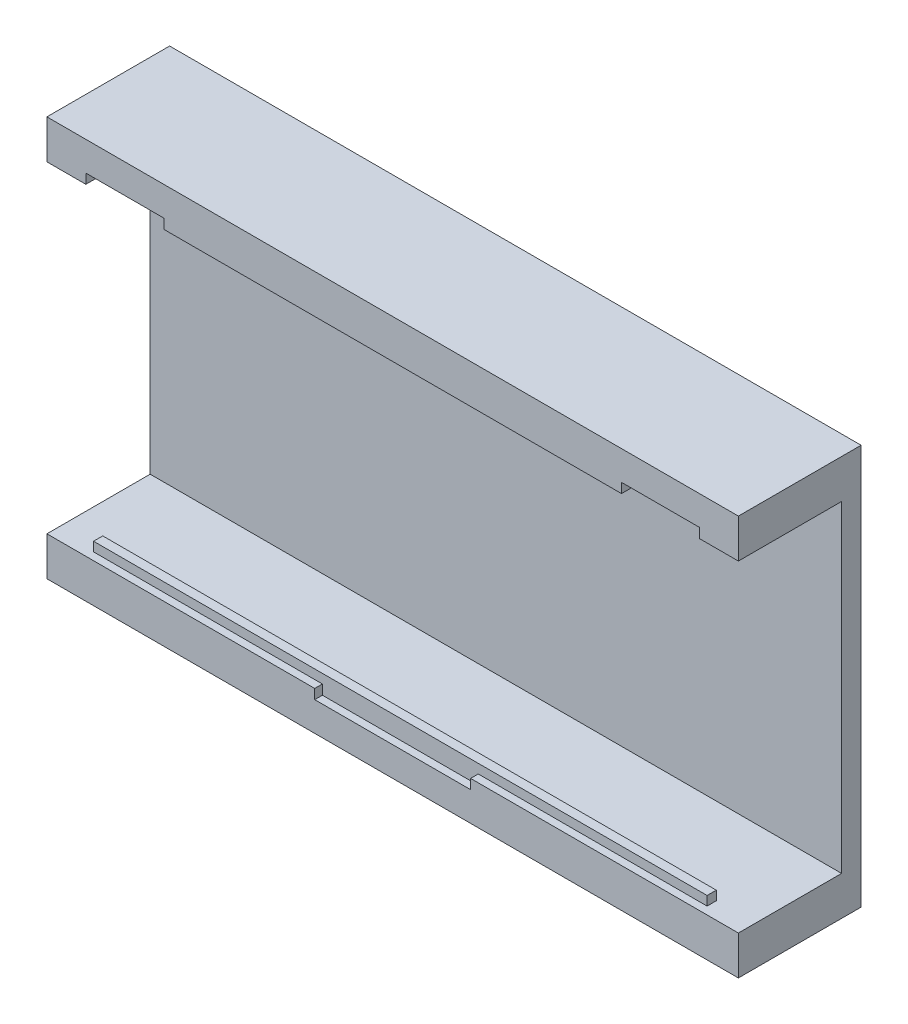
ISO-10303-21;
HEADER;
FILE_DESCRIPTION(('STEP AP214'),'2;1');
FILE_NAME('part.step','',(''),(''),'','','');
FILE_SCHEMA(('AUTOMOTIVE_DESIGN { 1 0 10303 214 1 1 1 1 }'));
ENDSEC;
DATA;
#1=APPLICATION_CONTEXT('core data for automotive mechanical design processes');
#2=APPLICATION_PROTOCOL_DEFINITION('international standard','automotive_design',2000,#1);
#3=PRODUCT_CONTEXT('',#1,'mechanical');
#4=PRODUCT('Part','Part','',(#3));
#5=PRODUCT_RELATED_PRODUCT_CATEGORY('part','',(#4));
#6=PRODUCT_DEFINITION_FORMATION('','',#4);
#7=PRODUCT_DEFINITION_CONTEXT('part definition',#1,'design');
#8=PRODUCT_DEFINITION('design','',#6,#7);
#9=PRODUCT_DEFINITION_SHAPE('','',#8);
#10=(LENGTH_UNIT() NAMED_UNIT(*) SI_UNIT(.MILLI.,.METRE.));
#11=(NAMED_UNIT(*) PLANE_ANGLE_UNIT() SI_UNIT($,.RADIAN.));
#12=(NAMED_UNIT(*) SI_UNIT($,.STERADIAN.) SOLID_ANGLE_UNIT());
#13=UNCERTAINTY_MEASURE_WITH_UNIT(LENGTH_MEASURE(1.E-05),#10,'distance_accuracy_value','');
#14=(GEOMETRIC_REPRESENTATION_CONTEXT(3) GLOBAL_UNCERTAINTY_ASSIGNED_CONTEXT((#13)) GLOBAL_UNIT_ASSIGNED_CONTEXT((#10,
#11,#12)) REPRESENTATION_CONTEXT('',''));
#15=CARTESIAN_POINT('',(0.,0.,0.));
#16=DIRECTION('',(0.,0.,1.));
#17=DIRECTION('',(1.,0.,0.));
#18=AXIS2_PLACEMENT_3D('',#15,#16,#17);
#19=CARTESIAN_POINT('',(100.000000000052,-500000.,-33.65));
#20=DIRECTION('',(0.,0.,-1.));
#21=DIRECTION('',(-1.,0.,0.));
#22=AXIS2_PLACEMENT_3D('',#19,#20,#21);
#23=PLANE('',#22);
#24=DIRECTION('',(0.,1.,0.));
#25=VECTOR('',#24,1.);
#26=CARTESIAN_POINT('',(-2.49999999999995,-500000.,-33.65));
#27=LINE('',#26,#25);
#28=CARTESIAN_POINT('',(-2.49999999999995,39.5301270189222,-33.65));
#29=VERTEX_POINT('',#28);
#30=CARTESIAN_POINT('',(-2.49999999999995,43.2,-33.65));
#31=VERTEX_POINT('',#30);
#32=EDGE_CURVE('E52',#29,#31,#27,.T.);
#33=ORIENTED_EDGE('',*,*,#32,.T.);
#34=CARTESIAN_POINT('',(0.,43.2,-33.65));
#35=DIRECTION('',(0.,0.,-1.));
#36=DIRECTION('',(-1.,0.,0.));
#37=AXIS2_PLACEMENT_3D('',#34,#35,#36);
#38=CIRCLE('',#37,2.5);
#39=CARTESIAN_POINT('',(2.50000000000005,43.2,-33.65));
#40=VERTEX_POINT('',#39);
#41=EDGE_CURVE('E12',#31,#40,#38,.T.);
#42=ORIENTED_EDGE('',*,*,#41,.T.);
#43=DIRECTION('',(0.,-1.,0.));
#44=VECTOR('',#43,1.);
#45=CARTESIAN_POINT('',(2.50000000000006,-500000.,-33.65));
#46=LINE('',#45,#44);
#47=CARTESIAN_POINT('',(2.50000000000006,39.5301270189066,-33.65));
#48=VERTEX_POINT('',#47);
#49=EDGE_CURVE('E273',#40,#48,#46,.T.);
#50=ORIENTED_EDGE('',*,*,#49,.T.);
#51=CARTESIAN_POINT('',(0.,35.2,-33.65));
#52=DIRECTION('',(0.,0.,-1.));
#53=DIRECTION('',(-1.,0.,0.));
#54=AXIS2_PLACEMENT_3D('',#51,#52,#53);
#55=CIRCLE('',#54,5.);
#56=EDGE_CURVE('E287',#48,#29,#55,.T.);
#57=ORIENTED_EDGE('',*,*,#56,.T.);
#58=EDGE_LOOP('',(#33,#42,#50,#57));
#59=FACE_BOUND('',#58,.T.);
#60=DIRECTION('',(0.,-1.,0.));
#61=VECTOR('',#60,1.);
#62=CARTESIAN_POINT('',(-112.7,52.5,-33.65));
#63=LINE('',#62,#61);
#64=CARTESIAN_POINT('',(-112.7,52.5,-33.65));
#65=VERTEX_POINT('',#64);
#66=CARTESIAN_POINT('',(-112.7,-52.5,-33.65));
#67=VERTEX_POINT('',#66);
#68=EDGE_CURVE('E297',#65,#67,#63,.T.);
#69=ORIENTED_EDGE('',*,*,#68,.T.);
#70=DIRECTION('',(-1.,0.,0.));
#71=VECTOR('',#70,1.);
#72=CARTESIAN_POINT('',(100.000000000052,-52.5000000000091,-33.65));
#73=LINE('',#72,#71);
#74=CARTESIAN_POINT('',(112.7,-52.5,-33.65));
#75=VERTEX_POINT('',#74);
#76=EDGE_CURVE('E439',#75,#67,#73,.T.);
#77=ORIENTED_EDGE('',*,*,#76,.F.);
#78=DIRECTION('',(0.,-1.,0.));
#79=VECTOR('',#78,1.);
#80=CARTESIAN_POINT('',(112.7,-47.5,-33.65));
#81=LINE('',#80,#79);
#82=CARTESIAN_POINT('',(112.7,52.5,-33.65));
#83=VERTEX_POINT('',#82);
#84=EDGE_CURVE('E253',#83,#75,#81,.T.);
#85=ORIENTED_EDGE('',*,*,#84,.F.);
#86=DIRECTION('',(-1.,0.,0.));
#87=VECTOR('',#86,1.);
#88=CARTESIAN_POINT('',(100.,52.5,-33.65));
#89=LINE('',#88,#87);
#90=EDGE_CURVE('E431',#83,#65,#89,.T.);
#91=ORIENTED_EDGE('',*,*,#90,.T.);
#92=EDGE_LOOP('',(#69,#77,#85,#91));
#93=FACE_BOUND('',#92,.T.);
#94=ADVANCED_FACE('F42',(#59,#93),#23,.F.);
#95=CARTESIAN_POINT('',(0.,0.,0.));
#96=DIRECTION('',(0.,0.,1.));
#97=DIRECTION('',(1.,0.,0.));
#98=AXIS2_PLACEMENT_3D('',#95,#96,#97);
#99=PLANE('',#98);
#100=DIRECTION('',(-1.,0.,0.));
#101=VECTOR('',#100,1.);
#102=CARTESIAN_POINT('',(100.,52.5,0.));
#103=LINE('',#102,#101);
#104=CARTESIAN_POINT('',(112.7,52.5,0.));
#105=VERTEX_POINT('',#104);
#106=CARTESIAN_POINT('',(100.,52.5,0.));
#107=VERTEX_POINT('',#106);
#108=EDGE_CURVE('E315',#105,#107,#103,.T.);
#109=ORIENTED_EDGE('',*,*,#108,.F.);
#110=DIRECTION('',(0.,-1.,0.));
#111=VECTOR('',#110,1.);
#112=CARTESIAN_POINT('',(112.7,0.,0.));
#113=LINE('',#112,#111);
#114=CARTESIAN_POINT('',(112.7,65.2,0.));
#115=VERTEX_POINT('',#114);
#116=EDGE_CURVE('E260',#115,#105,#113,.T.);
#117=ORIENTED_EDGE('',*,*,#116,.F.);
#118=DIRECTION('',(1.,0.,0.));
#119=VECTOR('',#118,1.);
#120=CARTESIAN_POINT('',(0.,65.2,0.));
#121=LINE('',#120,#119);
#122=CARTESIAN_POINT('',(-112.7,65.2,0.));
#123=VERTEX_POINT('',#122);
#124=EDGE_CURVE('E263',#123,#115,#121,.T.);
#125=ORIENTED_EDGE('',*,*,#124,.F.);
#126=DIRECTION('',(0.,1.,0.));
#127=VECTOR('',#126,1.);
#128=CARTESIAN_POINT('',(-112.7,0.,0.));
#129=LINE('',#128,#127);
#130=CARTESIAN_POINT('',(-112.7,52.5,0.));
#131=VERTEX_POINT('',#130);
#132=EDGE_CURVE('E455',#131,#123,#129,.T.);
#133=ORIENTED_EDGE('',*,*,#132,.F.);
#134=DIRECTION('',(-1.,0.,0.));
#135=VECTOR('',#134,1.);
#136=CARTESIAN_POINT('',(-100.,52.5,0.));
#137=LINE('',#136,#135);
#138=CARTESIAN_POINT('',(-100.,52.5,0.));
#139=VERTEX_POINT('',#138);
#140=EDGE_CURVE('E305',#139,#131,#137,.T.);
#141=ORIENTED_EDGE('',*,*,#140,.F.);
#142=DIRECTION('',(0.,-1.,0.));
#143=VECTOR('',#142,1.);
#144=CARTESIAN_POINT('',(-100.,0.,0.));
#145=LINE('',#144,#143);
#146=CARTESIAN_POINT('',(-100.,55.675,0.));
#147=VERTEX_POINT('',#146);
#148=EDGE_CURVE('E443',#147,#139,#145,.T.);
#149=ORIENTED_EDGE('',*,*,#148,.F.);
#150=DIRECTION('',(-1.,0.,0.));
#151=VECTOR('',#150,1.);
#152=CARTESIAN_POINT('',(-74.6,55.675,0.));
#153=LINE('',#152,#151);
#154=CARTESIAN_POINT('',(-74.6,55.675,0.));
#155=VERTEX_POINT('',#154);
#156=EDGE_CURVE('E344',#155,#147,#153,.T.);
#157=ORIENTED_EDGE('',*,*,#156,.F.);
#158=DIRECTION('',(0.,1.,0.));
#159=VECTOR('',#158,1.);
#160=CARTESIAN_POINT('',(-74.6,52.5,0.));
#161=LINE('',#160,#159);
#162=CARTESIAN_POINT('',(-74.6,52.5,0.));
#163=VERTEX_POINT('',#162);
#164=EDGE_CURVE('E336',#163,#155,#161,.T.);
#165=ORIENTED_EDGE('',*,*,#164,.F.);
#166=DIRECTION('',(-1.,0.,0.));
#167=VECTOR('',#166,1.);
#168=CARTESIAN_POINT('',(0.,52.5,0.));
#169=LINE('',#168,#167);
#170=CARTESIAN_POINT('',(74.6,52.5,0.));
#171=VERTEX_POINT('',#170);
#172=EDGE_CURVE('E67',#171,#163,#169,.T.);
#173=ORIENTED_EDGE('',*,*,#172,.F.);
#174=DIRECTION('',(0.,1.,0.));
#175=VECTOR('',#174,1.);
#176=CARTESIAN_POINT('',(74.6,52.5,0.));
#177=LINE('',#176,#175);
#178=CARTESIAN_POINT('',(74.6,55.675,0.));
#179=VERTEX_POINT('',#178);
#180=EDGE_CURVE('E320',#171,#179,#177,.T.);
#181=ORIENTED_EDGE('',*,*,#180,.T.);
#182=DIRECTION('',(1.,0.,0.));
#183=VECTOR('',#182,1.);
#184=CARTESIAN_POINT('',(74.6,55.675,0.));
#185=LINE('',#184,#183);
#186=CARTESIAN_POINT('',(100.,55.675,0.));
#187=VERTEX_POINT('',#186);
#188=EDGE_CURVE('E328',#179,#187,#185,.T.);
#189=ORIENTED_EDGE('',*,*,#188,.T.);
#190=DIRECTION('',(0.,1.,0.));
#191=VECTOR('',#190,1.);
#192=CARTESIAN_POINT('',(100.,0.,0.));
#193=LINE('',#192,#191);
#194=EDGE_CURVE('E59',#107,#187,#193,.T.);
#195=ORIENTED_EDGE('',*,*,#194,.F.);
#196=EDGE_LOOP('',(#109,#117,#125,#133,#141,#149,#157,#165,#173,#181,#189,#195));
#197=FACE_BOUND('',#196,.T.);
#198=ADVANCED_FACE('F470',(#197),#99,.T.);
#199=CARTESIAN_POINT('',(0.,52.5,-40.));
#200=DIRECTION('',(0.,1.,0.));
#201=DIRECTION('',(-1.,0.,0.));
#202=AXIS2_PLACEMENT_3D('',#199,#200,#201);
#203=PLANE('',#202);
#204=DIRECTION('',(0.,0.,1.));
#205=VECTOR('',#204,1.);
#206=CARTESIAN_POINT('',(74.6,52.5,-22.86));
#207=LINE('',#206,#205);
#208=CARTESIAN_POINT('',(74.6,52.5,-22.86));
#209=VERTEX_POINT('',#208);
#210=EDGE_CURVE('E334',#209,#171,#207,.T.);
#211=ORIENTED_EDGE('',*,*,#210,.T.);
#212=ORIENTED_EDGE('',*,*,#172,.T.);
#213=DIRECTION('',(0.,0.,1.));
#214=VECTOR('',#213,1.);
#215=CARTESIAN_POINT('',(-74.6,52.5,-22.86));
#216=LINE('',#215,#214);
#217=CARTESIAN_POINT('',(-74.6,52.5,-22.86));
#218=VERTEX_POINT('',#217);
#219=EDGE_CURVE('E353',#218,#163,#216,.T.);
#220=ORIENTED_EDGE('',*,*,#219,.F.);
#221=DIRECTION('',(1.,0.,0.));
#222=VECTOR('',#221,1.);
#223=CARTESIAN_POINT('',(-100.,52.5,-22.86));
#224=LINE('',#223,#222);
#225=CARTESIAN_POINT('',(-100.,52.5,-22.86));
#226=VERTEX_POINT('',#225);
#227=EDGE_CURVE('E343',#226,#218,#224,.T.);
#228=ORIENTED_EDGE('',*,*,#227,.F.);
#229=DIRECTION('',(0.,0.,1.));
#230=VECTOR('',#229,1.);
#231=CARTESIAN_POINT('',(-100.,52.5,-139.415258946405));
#232=LINE('',#231,#230);
#233=EDGE_CURVE('E309',#226,#139,#232,.T.);
#234=ORIENTED_EDGE('',*,*,#233,.T.);
#235=ORIENTED_EDGE('',*,*,#140,.T.);
#236=DIRECTION('',(0.,0.,1.));
#237=VECTOR('',#236,1.);
#238=CARTESIAN_POINT('',(-112.7,52.5,-139.415258946405));
#239=LINE('',#238,#237);
#240=EDGE_CURVE('E304',#65,#131,#239,.T.);
#241=ORIENTED_EDGE('',*,*,#240,.F.);
#242=ORIENTED_EDGE('',*,*,#90,.F.);
#243=DIRECTION('',(0.,0.,1.));
#244=VECTOR('',#243,1.);
#245=CARTESIAN_POINT('',(112.7,52.5,-139.415258946405));
#246=LINE('',#245,#244);
#247=EDGE_CURVE('E331',#83,#105,#246,.T.);
#248=ORIENTED_EDGE('',*,*,#247,.T.);
#249=ORIENTED_EDGE('',*,*,#108,.T.);
#250=DIRECTION('',(0.,0.,1.));
#251=VECTOR('',#250,1.);
#252=CARTESIAN_POINT('',(100.,52.5,-139.415258946405));
#253=LINE('',#252,#251);
#254=CARTESIAN_POINT('',(100.,52.5,-22.86));
#255=VERTEX_POINT('',#254);
#256=EDGE_CURVE('E828',#255,#107,#253,.T.);
#257=ORIENTED_EDGE('',*,*,#256,.F.);
#258=DIRECTION('',(-1.,0.,0.));
#259=VECTOR('',#258,1.);
#260=CARTESIAN_POINT('',(100.,52.5,-22.86));
#261=LINE('',#260,#259);
#262=EDGE_CURVE('E324',#255,#209,#261,.T.);
#263=ORIENTED_EDGE('',*,*,#262,.T.);
#264=EDGE_LOOP('',(#211,#212,#220,#228,#234,#235,#241,#242,#248,#249,#257,#263));
#265=FACE_BOUND('',#264,.T.);
#266=ADVANCED_FACE('F484',(#265),#203,.F.);
#267=CARTESIAN_POINT('',(112.7,-52.5,0.));
#268=VERTEX_POINT('',#267);
#269=CARTESIAN_POINT('',(112.7,-65.2,0.));
#270=VERTEX_POINT('',#269);
#271=EDGE_CURVE('E250',#268,#270,#113,.T.);
#272=ORIENTED_EDGE('',*,*,#271,.F.);
#273=DIRECTION('',(1.,0.,0.));
#274=VECTOR('',#273,1.);
#275=CARTESIAN_POINT('',(0.,-52.5,0.));
#276=LINE('',#275,#274);
#277=CARTESIAN_POINT('',(25.4,-52.5,0.));
#278=VERTEX_POINT('',#277);
#279=EDGE_CURVE('E234',#278,#268,#276,.T.);
#280=ORIENTED_EDGE('',*,*,#279,.F.);
#281=DIRECTION('',(0.,1.,0.));
#282=VECTOR('',#281,1.);
#283=CARTESIAN_POINT('',(25.3999999999999,-55.675,0.));
#284=LINE('',#283,#282);
#285=CARTESIAN_POINT('',(25.3999999999999,-55.675,0.));
#286=VERTEX_POINT('',#285);
#287=EDGE_CURVE('E361',#286,#278,#284,.T.);
#288=ORIENTED_EDGE('',*,*,#287,.F.);
#289=DIRECTION('',(1.,0.,0.));
#290=VECTOR('',#289,1.);
#291=CARTESIAN_POINT('',(-25.4000000000001,-55.675,0.));
#292=LINE('',#291,#290);
#293=CARTESIAN_POINT('',(-25.4000000000001,-55.675,0.));
#294=VERTEX_POINT('',#293);
#295=EDGE_CURVE('E365',#294,#286,#292,.T.);
#296=ORIENTED_EDGE('',*,*,#295,.F.);
#297=DIRECTION('',(0.,-1.,0.));
#298=VECTOR('',#297,1.);
#299=CARTESIAN_POINT('',(-25.4,-52.5,0.));
#300=LINE('',#299,#298);
#301=CARTESIAN_POINT('',(-25.4,-52.5,0.));
#302=VERTEX_POINT('',#301);
#303=EDGE_CURVE('E369',#302,#294,#300,.T.);
#304=ORIENTED_EDGE('',*,*,#303,.F.);
#305=CARTESIAN_POINT('',(-112.7,-52.5,0.));
#306=VERTEX_POINT('',#305);
#307=EDGE_CURVE('E244',#306,#302,#276,.T.);
#308=ORIENTED_EDGE('',*,*,#307,.F.);
#309=CARTESIAN_POINT('',(-112.7,-65.2,0.));
#310=VERTEX_POINT('',#309);
#311=EDGE_CURVE('E264',#310,#306,#129,.T.);
#312=ORIENTED_EDGE('',*,*,#311,.F.);
#313=DIRECTION('',(-1.,0.,0.));
#314=VECTOR('',#313,1.);
#315=CARTESIAN_POINT('',(0.,-65.2,0.));
#316=LINE('',#315,#314);
#317=EDGE_CURVE('E259',#270,#310,#316,.T.);
#318=ORIENTED_EDGE('',*,*,#317,.F.);
#319=EDGE_LOOP('',(#272,#280,#288,#296,#304,#308,#312,#318));
#320=FACE_BOUND('',#319,.T.);
#321=ADVANCED_FACE('F257',(#320),#99,.T.);
#322=CARTESIAN_POINT('',(-100.,0.,-40.));
#323=DIRECTION('',(-1.,0.,0.));
#324=DIRECTION('',(0.,-1.,0.));
#325=AXIS2_PLACEMENT_3D('',#322,#323,#324);
#326=PLANE('',#325);
#327=ORIENTED_EDGE('',*,*,#148,.T.);
#328=ORIENTED_EDGE('',*,*,#233,.F.);
#329=DIRECTION('',(0.,-1.,0.));
#330=VECTOR('',#329,1.);
#331=CARTESIAN_POINT('',(-100.,55.675,-22.86));
#332=LINE('',#331,#330);
#333=CARTESIAN_POINT('',(-100.,55.675,-22.86));
#334=VERTEX_POINT('',#333);
#335=EDGE_CURVE('E340',#334,#226,#332,.T.);
#336=ORIENTED_EDGE('',*,*,#335,.F.);
#337=DIRECTION('',(0.,0.,1.));
#338=VECTOR('',#337,1.);
#339=CARTESIAN_POINT('',(-100.,55.675,-22.86));
#340=LINE('',#339,#338);
#341=EDGE_CURVE('E358',#334,#147,#340,.T.);
#342=ORIENTED_EDGE('',*,*,#341,.T.);
#343=EDGE_LOOP('',(#327,#328,#336,#342));
#344=FACE_BOUND('',#343,.T.);
#345=ADVANCED_FACE('F44',(#344),#326,.F.);
#346=CARTESIAN_POINT('',(0.,-52.5,-40.));
#347=DIRECTION('',(0.,-1.,0.));
#348=DIRECTION('',(0.,0.,-1.));
#349=AXIS2_PLACEMENT_3D('',#346,#347,#348);
#350=PLANE('',#349);
#351=ORIENTED_EDGE('',*,*,#76,.T.);
#352=DIRECTION('',(0.,0.,1.));
#353=VECTOR('',#352,1.);
#354=CARTESIAN_POINT('',(-112.7,-52.5,-139.415258946405));
#355=LINE('',#354,#353);
#356=EDGE_CURVE('E303',#67,#306,#355,.T.);
#357=ORIENTED_EDGE('',*,*,#356,.T.);
#358=ORIENTED_EDGE('',*,*,#307,.T.);
#359=DIRECTION('',(0.,0.,1.));
#360=VECTOR('',#359,1.);
#361=CARTESIAN_POINT('',(-25.4,-52.5,-53.3991220454735));
#362=LINE('',#361,#360);
#363=CARTESIAN_POINT('',(-25.4,-52.5,-2.5));
#364=VERTEX_POINT('',#363);
#365=EDGE_CURVE('E368',#364,#302,#362,.T.);
#366=ORIENTED_EDGE('',*,*,#365,.F.);
#367=DIRECTION('',(-1.,0.,0.));
#368=VECTOR('',#367,1.);
#369=CARTESIAN_POINT('',(500000.,-52.4999999998678,-2.5));
#370=LINE('',#369,#368);
#371=CARTESIAN_POINT('',(-100.,-52.5,-2.5));
#372=VERTEX_POINT('',#371);
#373=EDGE_CURVE('E406',#364,#372,#370,.T.);
#374=ORIENTED_EDGE('',*,*,#373,.T.);
#375=DIRECTION('',(0.,0.,1.));
#376=VECTOR('',#375,1.);
#377=CARTESIAN_POINT('',(-100.,-52.5,-139.415258946405));
#378=LINE('',#377,#376);
#379=CARTESIAN_POINT('',(-100.,-52.5,-5.50000000000001));
#380=VERTEX_POINT('',#379);
#381=EDGE_CURVE('E311',#380,#372,#378,.T.);
#382=ORIENTED_EDGE('',*,*,#381,.F.);
#383=DIRECTION('',(-1.,0.,0.));
#384=VECTOR('',#383,1.);
#385=CARTESIAN_POINT('',(500000.,-52.4999999998678,-5.5));
#386=LINE('',#385,#384);
#387=CARTESIAN_POINT('',(100.000000000136,-52.5,-5.5));
#388=VERTEX_POINT('',#387);
#389=EDGE_CURVE('E403',#388,#380,#386,.T.);
#390=ORIENTED_EDGE('',*,*,#389,.F.);
#391=DIRECTION('',(0.,0.,1.));
#392=VECTOR('',#391,1.);
#393=CARTESIAN_POINT('',(100.,-52.5,-139.415258946405));
#394=LINE('',#393,#392);
#395=CARTESIAN_POINT('',(100.,-52.5,-2.5));
#396=VERTEX_POINT('',#395);
#397=EDGE_CURVE('E831',#388,#396,#394,.T.);
#398=ORIENTED_EDGE('',*,*,#397,.T.);
#399=CARTESIAN_POINT('',(25.4000000001042,-52.5,-2.5));
#400=VERTEX_POINT('',#399);
#401=EDGE_CURVE('E407',#396,#400,#370,.T.);
#402=ORIENTED_EDGE('',*,*,#401,.T.);
#403=DIRECTION('',(0.,0.,1.));
#404=VECTOR('',#403,1.);
#405=CARTESIAN_POINT('',(25.4,-52.5,-53.3991220454735));
#406=LINE('',#405,#404);
#407=EDGE_CURVE('E240',#400,#278,#406,.T.);
#408=ORIENTED_EDGE('',*,*,#407,.T.);
#409=ORIENTED_EDGE('',*,*,#279,.T.);
#410=DIRECTION('',(0.,0.,1.));
#411=VECTOR('',#410,1.);
#412=CARTESIAN_POINT('',(112.7,-52.5,-33.65));
#413=LINE('',#412,#411);
#414=EDGE_CURVE('E237',#75,#268,#413,.T.);
#415=ORIENTED_EDGE('',*,*,#414,.F.);
#416=EDGE_LOOP('',(#351,#357,#358,#366,#374,#382,#390,#398,#402,#408,#409,#415));
#417=FACE_BOUND('',#416,.T.);
#418=ADVANCED_FACE('F236',(#417),#350,.F.);
#419=CARTESIAN_POINT('',(100.,0.,-40.));
#420=DIRECTION('',(1.,0.,0.));
#421=DIRECTION('',(0.,1.,0.));
#422=AXIS2_PLACEMENT_3D('',#419,#420,#421);
#423=PLANE('',#422);
#424=DIRECTION('',(0.,-1.,0.));
#425=VECTOR('',#424,1.);
#426=CARTESIAN_POINT('',(100.,55.675,-22.86));
#427=LINE('',#426,#425);
#428=CARTESIAN_POINT('',(100.,55.675,-22.86));
#429=VERTEX_POINT('',#428);
#430=EDGE_CURVE('E316',#429,#255,#427,.T.);
#431=ORIENTED_EDGE('',*,*,#430,.T.);
#432=ORIENTED_EDGE('',*,*,#256,.T.);
#433=ORIENTED_EDGE('',*,*,#194,.T.);
#434=DIRECTION('',(0.,0.,1.));
#435=VECTOR('',#434,1.);
#436=CARTESIAN_POINT('',(100.,55.675,-22.86));
#437=LINE('',#436,#435);
#438=EDGE_CURVE('E327',#429,#187,#437,.T.);
#439=ORIENTED_EDGE('',*,*,#438,.F.);
#440=EDGE_LOOP('',(#431,#432,#433,#439));
#441=FACE_BOUND('',#440,.T.);
#442=ADVANCED_FACE('F535',(#441),#423,.F.);
#443=CARTESIAN_POINT('',(-112.7,0.,-40.));
#444=DIRECTION('',(1.,0.,0.));
#445=DIRECTION('',(0.,1.,0.));
#446=AXIS2_PLACEMENT_3D('',#443,#444,#445);
#447=PLANE('',#446);
#448=ORIENTED_EDGE('',*,*,#311,.T.);
#449=ORIENTED_EDGE('',*,*,#356,.F.);
#450=ORIENTED_EDGE('',*,*,#68,.F.);
#451=ORIENTED_EDGE('',*,*,#240,.T.);
#452=ORIENTED_EDGE('',*,*,#132,.T.);
#453=DIRECTION('',(0.,0.,1.));
#454=VECTOR('',#453,1.);
#455=CARTESIAN_POINT('',(-112.7,65.2,-40.));
#456=LINE('',#455,#454);
#457=CARTESIAN_POINT('',(-112.7,65.2,-40.));
#458=VERTEX_POINT('',#457);
#459=EDGE_CURVE('E270',#458,#123,#456,.T.);
#460=ORIENTED_EDGE('',*,*,#459,.F.);
#461=DIRECTION('',(0.,1.,0.));
#462=VECTOR('',#461,1.);
#463=CARTESIAN_POINT('',(-112.7,0.,-40.));
#464=LINE('',#463,#462);
#465=CARTESIAN_POINT('',(-112.7,-65.2,-40.));
#466=VERTEX_POINT('',#465);
#467=EDGE_CURVE('E269',#466,#458,#464,.T.);
#468=ORIENTED_EDGE('',*,*,#467,.F.);
#469=DIRECTION('',(0.,0.,1.));
#470=VECTOR('',#469,1.);
#471=CARTESIAN_POINT('',(-112.7,-65.2,-40.));
#472=LINE('',#471,#470);
#473=EDGE_CURVE('E279',#466,#310,#472,.T.);
#474=ORIENTED_EDGE('',*,*,#473,.T.);
#475=EDGE_LOOP('',(#448,#449,#450,#451,#452,#460,#468,#474));
#476=FACE_BOUND('',#475,.T.);
#477=ADVANCED_FACE('F462',(#476),#447,.F.);
#478=CARTESIAN_POINT('',(0.,65.2,-40.));
#479=DIRECTION('',(0.,-1.,0.));
#480=DIRECTION('',(1.,0.,0.));
#481=AXIS2_PLACEMENT_3D('',#478,#479,#480);
#482=PLANE('',#481);
#483=ORIENTED_EDGE('',*,*,#124,.T.);
#484=DIRECTION('',(0.,0.,1.));
#485=VECTOR('',#484,1.);
#486=CARTESIAN_POINT('',(112.7,65.2,-40.));
#487=LINE('',#486,#485);
#488=CARTESIAN_POINT('',(112.7,65.2,-40.));
#489=VERTEX_POINT('',#488);
#490=EDGE_CURVE('E274',#489,#115,#487,.T.);
#491=ORIENTED_EDGE('',*,*,#490,.F.);
#492=DIRECTION('',(1.,0.,0.));
#493=VECTOR('',#492,1.);
#494=CARTESIAN_POINT('',(0.,65.2,-40.));
#495=LINE('',#494,#493);
#496=EDGE_CURVE('E282',#458,#489,#495,.T.);
#497=ORIENTED_EDGE('',*,*,#496,.F.);
#498=ORIENTED_EDGE('',*,*,#459,.T.);
#499=EDGE_LOOP('',(#483,#491,#497,#498));
#500=FACE_BOUND('',#499,.T.);
#501=ADVANCED_FACE('F473',(#500),#482,.F.);
#502=CARTESIAN_POINT('',(112.7,0.,-40.));
#503=DIRECTION('',(-1.,0.,0.));
#504=DIRECTION('',(0.,-1.,0.));
#505=AXIS2_PLACEMENT_3D('',#502,#503,#504);
#506=PLANE('',#505);
#507=ORIENTED_EDGE('',*,*,#247,.F.);
#508=ORIENTED_EDGE('',*,*,#84,.T.);
#509=ORIENTED_EDGE('',*,*,#414,.T.);
#510=ORIENTED_EDGE('',*,*,#271,.T.);
#511=DIRECTION('',(0.,0.,1.));
#512=VECTOR('',#511,1.);
#513=CARTESIAN_POINT('',(112.7,-65.2,-40.));
#514=LINE('',#513,#512);
#515=CARTESIAN_POINT('',(112.7,-65.2,-40.));
#516=VERTEX_POINT('',#515);
#517=EDGE_CURVE('E277',#516,#270,#514,.T.);
#518=ORIENTED_EDGE('',*,*,#517,.F.);
#519=DIRECTION('',(0.,-1.,0.));
#520=VECTOR('',#519,1.);
#521=CARTESIAN_POINT('',(112.7,0.,-40.));
#522=LINE('',#521,#520);
#523=EDGE_CURVE('E448',#489,#516,#522,.T.);
#524=ORIENTED_EDGE('',*,*,#523,.F.);
#525=ORIENTED_EDGE('',*,*,#490,.T.);
#526=ORIENTED_EDGE('',*,*,#116,.T.);
#527=EDGE_LOOP('',(#507,#508,#509,#510,#518,#524,#525,#526));
#528=FACE_BOUND('',#527,.T.);
#529=ADVANCED_FACE('F248',(#528),#506,.F.);
#530=CARTESIAN_POINT('',(0.,-65.2,-40.));
#531=DIRECTION('',(0.,1.,0.));
#532=DIRECTION('',(-1.,0.,0.));
#533=AXIS2_PLACEMENT_3D('',#530,#531,#532);
#534=PLANE('',#533);
#535=ORIENTED_EDGE('',*,*,#317,.T.);
#536=ORIENTED_EDGE('',*,*,#473,.F.);
#537=DIRECTION('',(-1.,0.,0.));
#538=VECTOR('',#537,1.);
#539=CARTESIAN_POINT('',(0.,-65.2,-40.));
#540=LINE('',#539,#538);
#541=EDGE_CURVE('E446',#516,#466,#540,.T.);
#542=ORIENTED_EDGE('',*,*,#541,.F.);
#543=ORIENTED_EDGE('',*,*,#517,.T.);
#544=EDGE_LOOP('',(#535,#536,#542,#543));
#545=FACE_BOUND('',#544,.T.);
#546=ADVANCED_FACE('F523',(#545),#534,.F.);
#547=CARTESIAN_POINT('',(0.,0.,-40.));
#548=DIRECTION('',(0.,0.,1.));
#549=DIRECTION('',(1.,0.,0.));
#550=AXIS2_PLACEMENT_3D('',#547,#548,#549);
#551=PLANE('',#550);
#552=DIRECTION('',(0.,-1.,0.));
#553=VECTOR('',#552,1.);
#554=CARTESIAN_POINT('',(2.50000000000005,39.5301270189222,-40.));
#555=LINE('',#554,#553);
#556=CARTESIAN_POINT('',(2.50000000000005,43.2,-40.));
#557=VERTEX_POINT('',#556);
#558=CARTESIAN_POINT('',(2.50000000000005,39.5301270189222,-40.));
#559=VERTEX_POINT('',#558);
#560=EDGE_CURVE('E419',#557,#559,#555,.T.);
#561=ORIENTED_EDGE('',*,*,#560,.F.);
#562=CARTESIAN_POINT('',(0.,43.2,-40.));
#563=DIRECTION('',(0.,0.,-1.));
#564=DIRECTION('',(-1.,0.,0.));
#565=AXIS2_PLACEMENT_3D('',#562,#563,#564);
#566=CIRCLE('',#565,2.5);
#567=CARTESIAN_POINT('',(-2.49999999999995,43.2,-40.));
#568=VERTEX_POINT('',#567);
#569=EDGE_CURVE('E254',#568,#557,#566,.T.);
#570=ORIENTED_EDGE('',*,*,#569,.F.);
#571=DIRECTION('',(0.,1.,0.));
#572=VECTOR('',#571,1.);
#573=CARTESIAN_POINT('',(-2.49999999999995,43.2,-40.));
#574=LINE('',#573,#572);
#575=CARTESIAN_POINT('',(-2.49999999999995,39.5301270189222,-40.));
#576=VERTEX_POINT('',#575);
#577=EDGE_CURVE('E425',#576,#568,#574,.T.);
#578=ORIENTED_EDGE('',*,*,#577,.F.);
#579=CARTESIAN_POINT('',(0.,35.2,-40.));
#580=DIRECTION('',(0.,0.,-1.));
#581=DIRECTION('',(-1.,0.,0.));
#582=AXIS2_PLACEMENT_3D('',#579,#580,#581);
#583=CIRCLE('',#582,5.);
#584=EDGE_CURVE('E422',#559,#576,#583,.T.);
#585=ORIENTED_EDGE('',*,*,#584,.F.);
#586=EDGE_LOOP('',(#561,#570,#578,#585));
#587=FACE_BOUND('',#586,.T.);
#588=ORIENTED_EDGE('',*,*,#467,.T.);
#589=ORIENTED_EDGE('',*,*,#496,.T.);
#590=ORIENTED_EDGE('',*,*,#523,.T.);
#591=ORIENTED_EDGE('',*,*,#541,.T.);
#592=EDGE_LOOP('',(#588,#589,#590,#591));
#593=FACE_BOUND('',#592,.T.);
#594=ADVANCED_FACE('F476',(#587,#593),#551,.F.);
#595=CARTESIAN_POINT('',(0.,43.2,0.));
#596=DIRECTION('',(0.,0.,-1.));
#597=DIRECTION('',(-1.,0.,0.));
#598=AXIS2_PLACEMENT_3D('',#595,#596,#597);
#599=CYLINDRICAL_SURFACE('',#598,2.5);
#600=DIRECTION('',(0.,0.,-1.));
#601=VECTOR('',#600,1.);
#602=CARTESIAN_POINT('',(-2.49999999999995,43.2,0.));
#603=LINE('',#602,#601);
#604=EDGE_CURVE('E429',#31,#568,#603,.T.);
#605=ORIENTED_EDGE('',*,*,#604,.T.);
#606=ORIENTED_EDGE('',*,*,#569,.T.);
#607=DIRECTION('',(0.,0.,-1.));
#608=VECTOR('',#607,1.);
#609=CARTESIAN_POINT('',(2.50000000000005,43.2,0.));
#610=LINE('',#609,#608);
#611=EDGE_CURVE('E428',#40,#557,#610,.T.);
#612=ORIENTED_EDGE('',*,*,#611,.F.);
#613=ORIENTED_EDGE('',*,*,#41,.F.);
#614=EDGE_LOOP('',(#605,#606,#612,#613));
#615=FACE_BOUND('',#614,.T.);
#616=ADVANCED_FACE('F520',(#615),#599,.F.);
#617=CARTESIAN_POINT('',(-2.49999999999995,43.2,0.));
#618=DIRECTION('',(-1.,0.,0.));
#619=DIRECTION('',(0.,0.,1.));
#620=AXIS2_PLACEMENT_3D('',#617,#618,#619);
#621=PLANE('',#620);
#622=DIRECTION('',(0.,0.,-1.));
#623=VECTOR('',#622,1.);
#624=CARTESIAN_POINT('',(-2.49999999999995,39.5301270189222,0.));
#625=LINE('',#624,#623);
#626=EDGE_CURVE('E432',#29,#576,#625,.T.);
#627=ORIENTED_EDGE('',*,*,#626,.T.);
#628=ORIENTED_EDGE('',*,*,#577,.T.);
#629=ORIENTED_EDGE('',*,*,#604,.F.);
#630=ORIENTED_EDGE('',*,*,#32,.F.);
#631=EDGE_LOOP('',(#627,#628,#629,#630));
#632=FACE_BOUND('',#631,.T.);
#633=ADVANCED_FACE('F588',(#632),#621,.F.);
#634=CARTESIAN_POINT('',(0.,35.2,0.));
#635=DIRECTION('',(0.,0.,-1.));
#636=DIRECTION('',(-1.,0.,0.));
#637=AXIS2_PLACEMENT_3D('',#634,#635,#636);
#638=CYLINDRICAL_SURFACE('',#637,5.);
#639=DIRECTION('',(0.,0.,-1.));
#640=VECTOR('',#639,1.);
#641=CARTESIAN_POINT('',(2.50000000000005,39.5301270189222,0.));
#642=LINE('',#641,#640);
#643=EDGE_CURVE('E434',#48,#559,#642,.T.);
#644=ORIENTED_EDGE('',*,*,#643,.T.);
#645=ORIENTED_EDGE('',*,*,#584,.T.);
#646=ORIENTED_EDGE('',*,*,#626,.F.);
#647=ORIENTED_EDGE('',*,*,#56,.F.);
#648=EDGE_LOOP('',(#644,#645,#646,#647));
#649=FACE_BOUND('',#648,.T.);
#650=ADVANCED_FACE('F595',(#649),#638,.F.);
#651=CARTESIAN_POINT('',(2.50000000000005,39.5301270189222,0.));
#652=DIRECTION('',(1.,0.,0.));
#653=DIRECTION('',(0.,0.,-1.));
#654=AXIS2_PLACEMENT_3D('',#651,#652,#653);
#655=PLANE('',#654);
#656=ORIENTED_EDGE('',*,*,#611,.T.);
#657=ORIENTED_EDGE('',*,*,#560,.T.);
#658=ORIENTED_EDGE('',*,*,#643,.F.);
#659=ORIENTED_EDGE('',*,*,#49,.F.);
#660=EDGE_LOOP('',(#656,#657,#658,#659));
#661=FACE_BOUND('',#660,.T.);
#662=ADVANCED_FACE('F603',(#661),#655,.F.);
#663=CARTESIAN_POINT('',(500000.,-49.4999999998678,-2.5));
#664=DIRECTION('',(0.,0.,-1.));
#665=DIRECTION('',(0.,1.,0.));
#666=AXIS2_PLACEMENT_3D('',#663,#664,#665);
#667=PLANE('',#666);
#668=DIRECTION('',(0.,-1.,0.));
#669=VECTOR('',#668,1.);
#670=CARTESIAN_POINT('',(100.000000000023,-49.4999999999339,-2.5));
#671=LINE('',#670,#669);
#672=CARTESIAN_POINT('',(100.000000000023,-49.5,-2.5));
#673=VERTEX_POINT('',#672);
#674=EDGE_CURVE('E409',#673,#396,#671,.T.);
#675=ORIENTED_EDGE('',*,*,#674,.F.);
#676=DIRECTION('',(-1.,0.,0.));
#677=VECTOR('',#676,1.);
#678=CARTESIAN_POINT('',(500000.,-49.4999999998678,-2.5));
#679=LINE('',#678,#677);
#680=CARTESIAN_POINT('',(-100.000000000023,-49.5,-2.5));
#681=VERTEX_POINT('',#680);
#682=EDGE_CURVE('E395',#673,#681,#679,.T.);
#683=ORIENTED_EDGE('',*,*,#682,.T.);
#684=DIRECTION('',(0.,-1.,0.));
#685=VECTOR('',#684,1.);
#686=CARTESIAN_POINT('',(-100.,-49.5,-2.5));
#687=LINE('',#686,#685);
#688=EDGE_CURVE('E388',#681,#372,#687,.T.);
#689=ORIENTED_EDGE('',*,*,#688,.T.);
#690=ORIENTED_EDGE('',*,*,#373,.F.);
#691=DIRECTION('',(0.,-1.,0.));
#692=VECTOR('',#691,1.);
#693=CARTESIAN_POINT('',(-25.4,-52.5,-2.5));
#694=LINE('',#693,#692);
#695=CARTESIAN_POINT('',(-25.4000000000001,-55.675,-2.5));
#696=VERTEX_POINT('',#695);
#697=EDGE_CURVE('E381',#364,#696,#694,.T.);
#698=ORIENTED_EDGE('',*,*,#697,.T.);
#699=DIRECTION('',(1.,0.,0.));
#700=VECTOR('',#699,1.);
#701=CARTESIAN_POINT('',(-25.4000000000001,-55.675,-2.5));
#702=LINE('',#701,#700);
#703=CARTESIAN_POINT('',(25.3999999999999,-55.675,-2.5));
#704=VERTEX_POINT('',#703);
#705=EDGE_CURVE('E377',#696,#704,#702,.T.);
#706=ORIENTED_EDGE('',*,*,#705,.T.);
#707=DIRECTION('',(0.,1.,0.));
#708=VECTOR('',#707,1.);
#709=CARTESIAN_POINT('',(25.3999999999999,-55.675,-2.5));
#710=LINE('',#709,#708);
#711=EDGE_CURVE('E373',#704,#400,#710,.T.);
#712=ORIENTED_EDGE('',*,*,#711,.T.);
#713=ORIENTED_EDGE('',*,*,#401,.F.);
#714=EDGE_LOOP('',(#675,#683,#689,#690,#698,#706,#712,#713));
#715=FACE_BOUND('',#714,.T.);
#716=ADVANCED_FACE('F611',(#715),#667,.F.);
#717=CARTESIAN_POINT('',(500000.,-49.4999999998678,-5.5));
#718=DIRECTION('',(0.,-1.,0.));
#719=DIRECTION('',(1.,0.,0.));
#720=AXIS2_PLACEMENT_3D('',#717,#718,#719);
#721=PLANE('',#720);
#722=DIRECTION('',(0.,0.,1.));
#723=VECTOR('',#722,1.);
#724=CARTESIAN_POINT('',(100.000000000023,-49.5,-5.5));
#725=LINE('',#724,#723);
#726=CARTESIAN_POINT('',(100.000000000023,-49.5,-5.5));
#727=VERTEX_POINT('',#726);
#728=EDGE_CURVE('E410',#727,#673,#725,.T.);
#729=ORIENTED_EDGE('',*,*,#728,.F.);
#730=DIRECTION('',(-1.,0.,0.));
#731=VECTOR('',#730,1.);
#732=CARTESIAN_POINT('',(500000.,-49.4999999998678,-5.5));
#733=LINE('',#732,#731);
#734=CARTESIAN_POINT('',(-100.,-49.5,-5.5));
#735=VERTEX_POINT('',#734);
#736=EDGE_CURVE('E400',#727,#735,#733,.T.);
#737=ORIENTED_EDGE('',*,*,#736,.T.);
#738=DIRECTION('',(0.,0.,1.));
#739=VECTOR('',#738,1.);
#740=CARTESIAN_POINT('',(-100.,-49.5,-5.5));
#741=LINE('',#740,#739);
#742=EDGE_CURVE('E392',#735,#681,#741,.T.);
#743=ORIENTED_EDGE('',*,*,#742,.T.);
#744=ORIENTED_EDGE('',*,*,#682,.F.);
#745=EDGE_LOOP('',(#729,#737,#743,#744));
#746=FACE_BOUND('',#745,.T.);
#747=ADVANCED_FACE('F619',(#746),#721,.F.);
#748=CARTESIAN_POINT('',(500000.,-52.4999999998678,-5.5));
#749=DIRECTION('',(0.,0.,1.));
#750=DIRECTION('',(0.,-1.,0.));
#751=AXIS2_PLACEMENT_3D('',#748,#749,#750);
#752=PLANE('',#751);
#753=DIRECTION('',(0.,1.,0.));
#754=VECTOR('',#753,1.);
#755=CARTESIAN_POINT('',(100.000000000023,-52.4999999999339,-5.5));
#756=LINE('',#755,#754);
#757=EDGE_CURVE('E412',#388,#727,#756,.T.);
#758=ORIENTED_EDGE('',*,*,#757,.F.);
#759=ORIENTED_EDGE('',*,*,#389,.T.);
#760=DIRECTION('',(0.,1.,0.));
#761=VECTOR('',#760,1.);
#762=CARTESIAN_POINT('',(-100.,-52.5,-5.5));
#763=LINE('',#762,#761);
#764=EDGE_CURVE('E389',#380,#735,#763,.T.);
#765=ORIENTED_EDGE('',*,*,#764,.T.);
#766=ORIENTED_EDGE('',*,*,#736,.F.);
#767=EDGE_LOOP('',(#758,#759,#765,#766));
#768=FACE_BOUND('',#767,.T.);
#769=ADVANCED_FACE('F613',(#768),#752,.F.);
#770=CARTESIAN_POINT('',(-25.4,-52.5,-53.3991220454735));
#771=DIRECTION('',(-1.,0.,0.));
#772=DIRECTION('',(0.,-1.,0.));
#773=AXIS2_PLACEMENT_3D('',#770,#771,#772);
#774=PLANE('',#773);
#775=ORIENTED_EDGE('',*,*,#365,.T.);
#776=ORIENTED_EDGE('',*,*,#303,.T.);
#777=DIRECTION('',(0.,0.,1.));
#778=VECTOR('',#777,1.);
#779=CARTESIAN_POINT('',(-25.4000000000001,-55.675,-53.3991220454735));
#780=LINE('',#779,#778);
#781=EDGE_CURVE('E380',#696,#294,#780,.T.);
#782=ORIENTED_EDGE('',*,*,#781,.F.);
#783=ORIENTED_EDGE('',*,*,#697,.F.);
#784=EDGE_LOOP('',(#775,#776,#782,#783));
#785=FACE_BOUND('',#784,.T.);
#786=ADVANCED_FACE('F622',(#785),#774,.F.);
#787=CARTESIAN_POINT('',(-25.4000000000001,-55.675,-53.3991220454735));
#788=DIRECTION('',(0.,-1.,0.));
#789=DIRECTION('',(0.,0.,-1.));
#790=AXIS2_PLACEMENT_3D('',#787,#788,#789);
#791=PLANE('',#790);
#792=ORIENTED_EDGE('',*,*,#781,.T.);
#793=ORIENTED_EDGE('',*,*,#295,.T.);
#794=DIRECTION('',(0.,0.,1.));
#795=VECTOR('',#794,1.);
#796=CARTESIAN_POINT('',(25.3999999999999,-55.675,-53.3991220454735));
#797=LINE('',#796,#795);
#798=EDGE_CURVE('E376',#704,#286,#797,.T.);
#799=ORIENTED_EDGE('',*,*,#798,.F.);
#800=ORIENTED_EDGE('',*,*,#705,.F.);
#801=EDGE_LOOP('',(#792,#793,#799,#800));
#802=FACE_BOUND('',#801,.T.);
#803=ADVANCED_FACE('F641',(#802),#791,.F.);
#804=CARTESIAN_POINT('',(25.3999999999999,-55.675,-53.3991220454735));
#805=DIRECTION('',(1.,0.,0.));
#806=DIRECTION('',(0.,1.,0.));
#807=AXIS2_PLACEMENT_3D('',#804,#805,#806);
#808=PLANE('',#807);
#809=ORIENTED_EDGE('',*,*,#798,.T.);
#810=ORIENTED_EDGE('',*,*,#287,.T.);
#811=ORIENTED_EDGE('',*,*,#407,.F.);
#812=ORIENTED_EDGE('',*,*,#711,.F.);
#813=EDGE_LOOP('',(#809,#810,#811,#812));
#814=FACE_BOUND('',#813,.T.);
#815=ADVANCED_FACE('F649',(#814),#808,.F.);
#816=CARTESIAN_POINT('',(-74.6,55.675,-22.86));
#817=DIRECTION('',(0.,1.,0.));
#818=DIRECTION('',(-1.,0.,0.));
#819=AXIS2_PLACEMENT_3D('',#816,#817,#818);
#820=PLANE('',#819);
#821=ORIENTED_EDGE('',*,*,#156,.T.);
#822=ORIENTED_EDGE('',*,*,#341,.F.);
#823=DIRECTION('',(-1.,0.,0.));
#824=VECTOR('',#823,1.);
#825=CARTESIAN_POINT('',(-74.6,55.675,-22.86));
#826=LINE('',#825,#824);
#827=CARTESIAN_POINT('',(-74.6,55.675,-22.86));
#828=VERTEX_POINT('',#827);
#829=EDGE_CURVE('E350',#828,#334,#826,.T.);
#830=ORIENTED_EDGE('',*,*,#829,.F.);
#831=DIRECTION('',(0.,0.,1.));
#832=VECTOR('',#831,1.);
#833=CARTESIAN_POINT('',(-74.6,55.675,-22.86));
#834=LINE('',#833,#832);
#835=EDGE_CURVE('E362',#828,#155,#834,.T.);
#836=ORIENTED_EDGE('',*,*,#835,.T.);
#837=EDGE_LOOP('',(#821,#822,#830,#836));
#838=FACE_BOUND('',#837,.T.);
#839=ADVANCED_FACE('F491',(#838),#820,.F.);
#840=CARTESIAN_POINT('',(-74.6,52.5,-22.86));
#841=DIRECTION('',(1.,0.,0.));
#842=DIRECTION('',(0.,0.,-1.));
#843=AXIS2_PLACEMENT_3D('',#840,#841,#842);
#844=PLANE('',#843);
#845=ORIENTED_EDGE('',*,*,#164,.T.);
#846=ORIENTED_EDGE('',*,*,#835,.F.);
#847=DIRECTION('',(0.,1.,0.));
#848=VECTOR('',#847,1.);
#849=CARTESIAN_POINT('',(-74.6,52.5,-22.86));
#850=LINE('',#849,#848);
#851=EDGE_CURVE('E347',#218,#828,#850,.T.);
#852=ORIENTED_EDGE('',*,*,#851,.F.);
#853=ORIENTED_EDGE('',*,*,#219,.T.);
#854=EDGE_LOOP('',(#845,#846,#852,#853));
#855=FACE_BOUND('',#854,.T.);
#856=ADVANCED_FACE('F494',(#855),#844,.F.);
#857=CARTESIAN_POINT('',(0.,0.,-22.86));
#858=DIRECTION('',(0.,0.,1.));
#859=DIRECTION('',(1.,0.,0.));
#860=AXIS2_PLACEMENT_3D('',#857,#858,#859);
#861=PLANE('',#860);
#862=ORIENTED_EDGE('',*,*,#335,.T.);
#863=ORIENTED_EDGE('',*,*,#227,.T.);
#864=ORIENTED_EDGE('',*,*,#851,.T.);
#865=ORIENTED_EDGE('',*,*,#829,.T.);
#866=EDGE_LOOP('',(#862,#863,#864,#865));
#867=FACE_BOUND('',#866,.T.);
#868=ADVANCED_FACE('F496',(#867),#861,.T.);
#869=CARTESIAN_POINT('',(74.6,52.5,-22.86));
#870=DIRECTION('',(1.,0.,0.));
#871=DIRECTION('',(0.,0.,-1.));
#872=AXIS2_PLACEMENT_3D('',#869,#870,#871);
#873=PLANE('',#872);
#874=ORIENTED_EDGE('',*,*,#180,.F.);
#875=ORIENTED_EDGE('',*,*,#210,.F.);
#876=DIRECTION('',(0.,1.,0.));
#877=VECTOR('',#876,1.);
#878=CARTESIAN_POINT('',(74.6,52.5,-22.86));
#879=LINE('',#878,#877);
#880=CARTESIAN_POINT('',(74.6,55.675,-22.86));
#881=VERTEX_POINT('',#880);
#882=EDGE_CURVE('E322',#209,#881,#879,.T.);
#883=ORIENTED_EDGE('',*,*,#882,.T.);
#884=DIRECTION('',(0.,0.,1.));
#885=VECTOR('',#884,1.);
#886=CARTESIAN_POINT('',(74.6,55.675,-22.86));
#887=LINE('',#886,#885);
#888=EDGE_CURVE('E337',#881,#179,#887,.T.);
#889=ORIENTED_EDGE('',*,*,#888,.T.);
#890=EDGE_LOOP('',(#874,#875,#883,#889));
#891=FACE_BOUND('',#890,.T.);
#892=ADVANCED_FACE('F498',(#891),#873,.T.);
#893=CARTESIAN_POINT('',(74.6,55.675,-22.86));
#894=DIRECTION('',(0.,-1.,0.));
#895=DIRECTION('',(1.,0.,0.));
#896=AXIS2_PLACEMENT_3D('',#893,#894,#895);
#897=PLANE('',#896);
#898=ORIENTED_EDGE('',*,*,#188,.F.);
#899=ORIENTED_EDGE('',*,*,#888,.F.);
#900=DIRECTION('',(1.,0.,0.));
#901=VECTOR('',#900,1.);
#902=CARTESIAN_POINT('',(74.6,55.675,-22.86));
#903=LINE('',#902,#901);
#904=EDGE_CURVE('E319',#881,#429,#903,.T.);
#905=ORIENTED_EDGE('',*,*,#904,.T.);
#906=ORIENTED_EDGE('',*,*,#438,.T.);
#907=EDGE_LOOP('',(#898,#899,#905,#906));
#908=FACE_BOUND('',#907,.T.);
#909=ADVANCED_FACE('F504',(#908),#897,.T.);
#910=CARTESIAN_POINT('',(0.,0.,-22.86));
#911=DIRECTION('',(0.,0.,1.));
#912=DIRECTION('',(-1.,0.,0.));
#913=AXIS2_PLACEMENT_3D('',#910,#911,#912);
#914=PLANE('',#913);
#915=ORIENTED_EDGE('',*,*,#430,.F.);
#916=ORIENTED_EDGE('',*,*,#904,.F.);
#917=ORIENTED_EDGE('',*,*,#882,.F.);
#918=ORIENTED_EDGE('',*,*,#262,.F.);
#919=EDGE_LOOP('',(#915,#916,#917,#918));
#920=FACE_BOUND('',#919,.T.);
#921=ADVANCED_FACE('F682',(#920),#914,.T.);
#922=CARTESIAN_POINT('',(-100.,52.5,-139.415258946405));
#923=DIRECTION('',(1.,0.,0.));
#924=DIRECTION('',(0.,1.,0.));
#925=AXIS2_PLACEMENT_3D('',#922,#923,#924);
#926=PLANE('',#925);
#927=ORIENTED_EDGE('',*,*,#742,.F.);
#928=ORIENTED_EDGE('',*,*,#764,.F.);
#929=ORIENTED_EDGE('',*,*,#381,.T.);
#930=ORIENTED_EDGE('',*,*,#688,.F.);
#931=EDGE_LOOP('',(#927,#928,#929,#930));
#932=FACE_BOUND('',#931,.T.);
#933=ADVANCED_FACE('F718',(#932),#926,.F.);
#934=CARTESIAN_POINT('',(100.,52.5,-139.415258946405));
#935=DIRECTION('',(-1.,0.,0.));
#936=DIRECTION('',(0.,-1.,0.));
#937=AXIS2_PLACEMENT_3D('',#934,#935,#936);
#938=PLANE('',#937);
#939=ORIENTED_EDGE('',*,*,#397,.F.);
#940=ORIENTED_EDGE('',*,*,#757,.T.);
#941=ORIENTED_EDGE('',*,*,#728,.T.);
#942=ORIENTED_EDGE('',*,*,#674,.T.);
#943=EDGE_LOOP('',(#939,#940,#941,#942));
#944=FACE_BOUND('',#943,.T.);
#945=ADVANCED_FACE('F724',(#944),#938,.F.);
#946=CLOSED_SHELL('',(#94,#198,#266,#321,#345,#418,#442,#477,#501,#529,#546,#594,#616,#633,#650,
#662,#716,#747,#769,#786,#803,#815,#839,#856,#868,#892,#909,#921,#933,#945));
#947=MANIFOLD_SOLID_BREP('B2',#946);
#948=ADVANCED_BREP_SHAPE_REPRESENTATION('',(#18,#947),#14);
#949=SHAPE_DEFINITION_REPRESENTATION(#9,#948);
ENDSEC;
END-ISO-10303-21;
